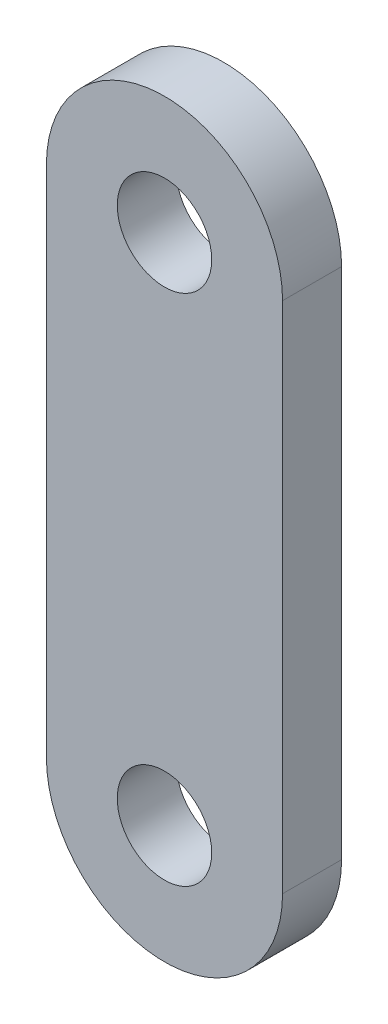
ISO-10303-21;
HEADER;
FILE_DESCRIPTION(('STEP AP214'),'2;1');
FILE_NAME('part.step','',(''),(''),'','','');
FILE_SCHEMA(('AUTOMOTIVE_DESIGN { 1 0 10303 214 1 1 1 1 }'));
ENDSEC;
DATA;
#1=APPLICATION_CONTEXT('core data for automotive mechanical design processes');
#2=APPLICATION_PROTOCOL_DEFINITION('international standard','automotive_design',2000,#1);
#3=PRODUCT_CONTEXT('',#1,'mechanical');
#4=PRODUCT('Part','Part','',(#3));
#5=PRODUCT_RELATED_PRODUCT_CATEGORY('part','',(#4));
#6=PRODUCT_DEFINITION_FORMATION('','',#4);
#7=PRODUCT_DEFINITION_CONTEXT('part definition',#1,'design');
#8=PRODUCT_DEFINITION('design','',#6,#7);
#9=PRODUCT_DEFINITION_SHAPE('','',#8);
#10=(LENGTH_UNIT() NAMED_UNIT(*) SI_UNIT(.MILLI.,.METRE.));
#11=(NAMED_UNIT(*) PLANE_ANGLE_UNIT() SI_UNIT($,.RADIAN.));
#12=(NAMED_UNIT(*) SI_UNIT($,.STERADIAN.) SOLID_ANGLE_UNIT());
#13=UNCERTAINTY_MEASURE_WITH_UNIT(LENGTH_MEASURE(1.E-05),#10,'distance_accuracy_value','');
#14=(GEOMETRIC_REPRESENTATION_CONTEXT(3) GLOBAL_UNCERTAINTY_ASSIGNED_CONTEXT((#13)) GLOBAL_UNIT_ASSIGNED_CONTEXT((#10,
#11,#12)) REPRESENTATION_CONTEXT('',''));
#15=CARTESIAN_POINT('',(0.,0.,0.));
#16=DIRECTION('',(0.,0.,1.));
#17=DIRECTION('',(1.,0.,0.));
#18=AXIS2_PLACEMENT_3D('',#15,#16,#17);
#19=CARTESIAN_POINT('',(0.,0.,5.));
#20=DIRECTION('',(0.,0.,1.));
#21=DIRECTION('',(1.,0.,0.));
#22=AXIS2_PLACEMENT_3D('',#19,#20,#21);
#23=PLANE('',#22);
#24=CARTESIAN_POINT('',(0.,43.5,5.));
#25=DIRECTION('',(0.,0.,1.));
#26=DIRECTION('',(1.,0.,0.));
#27=AXIS2_PLACEMENT_3D('',#24,#25,#26);
#28=CIRCLE('',#27,4.);
#29=CARTESIAN_POINT('',(4.,43.5,5.));
#30=VERTEX_POINT('',#29);
#31=EDGE_CURVE('E118',#30,#30,#28,.T.);
#32=ORIENTED_EDGE('',*,*,#31,.F.);
#33=EDGE_LOOP('',(#32));
#34=FACE_BOUND('',#33,.T.);
#35=CARTESIAN_POINT('',(0.,0.,5.));
#36=DIRECTION('',(0.,0.,1.));
#37=DIRECTION('',(1.,0.,0.));
#38=AXIS2_PLACEMENT_3D('',#35,#36,#37);
#39=CIRCLE('',#38,10.);
#40=CARTESIAN_POINT('',(-10.,0.,5.));
#41=VERTEX_POINT('',#40);
#42=CARTESIAN_POINT('',(10.,0.,5.));
#43=VERTEX_POINT('',#42);
#44=EDGE_CURVE('E96',#41,#43,#39,.T.);
#45=ORIENTED_EDGE('',*,*,#44,.T.);
#46=DIRECTION('',(0.,1.,0.));
#47=VECTOR('',#46,1.);
#48=CARTESIAN_POINT('',(10.,0.,5.));
#49=LINE('',#48,#47);
#50=CARTESIAN_POINT('',(10.,43.5,5.));
#51=VERTEX_POINT('',#50);
#52=EDGE_CURVE('E91',#43,#51,#49,.T.);
#53=ORIENTED_EDGE('',*,*,#52,.T.);
#54=CARTESIAN_POINT('',(0.,43.5,5.));
#55=DIRECTION('',(0.,0.,1.));
#56=DIRECTION('',(1.,0.,0.));
#57=AXIS2_PLACEMENT_3D('',#54,#55,#56);
#58=CIRCLE('',#57,10.);
#59=CARTESIAN_POINT('',(-10.,43.5,5.));
#60=VERTEX_POINT('',#59);
#61=EDGE_CURVE('E94',#51,#60,#58,.T.);
#62=ORIENTED_EDGE('',*,*,#61,.T.);
#63=DIRECTION('',(0.,-1.,0.));
#64=VECTOR('',#63,1.);
#65=CARTESIAN_POINT('',(-10.,0.,5.));
#66=LINE('',#65,#64);
#67=EDGE_CURVE('E61',#60,#41,#66,.T.);
#68=ORIENTED_EDGE('',*,*,#67,.T.);
#69=EDGE_LOOP('',(#45,#53,#62,#68));
#70=FACE_BOUND('',#69,.T.);
#71=CARTESIAN_POINT('',(0.,0.,5.));
#72=DIRECTION('',(0.,0.,1.));
#73=DIRECTION('',(1.,0.,0.));
#74=AXIS2_PLACEMENT_3D('',#71,#72,#73);
#75=CIRCLE('',#74,4.);
#76=CARTESIAN_POINT('',(4.,0.,5.));
#77=VERTEX_POINT('',#76);
#78=EDGE_CURVE('E140',#77,#77,#75,.T.);
#79=ORIENTED_EDGE('',*,*,#78,.F.);
#80=EDGE_LOOP('',(#79));
#81=FACE_BOUND('',#80,.T.);
#82=ADVANCED_FACE('F43',(#34,#70,#81),#23,.T.);
#83=CARTESIAN_POINT('',(0.,0.,0.));
#84=DIRECTION('',(0.,0.,1.));
#85=DIRECTION('',(1.,0.,0.));
#86=AXIS2_PLACEMENT_3D('',#83,#84,#85);
#87=PLANE('',#86);
#88=CARTESIAN_POINT('',(0.,0.,0.));
#89=DIRECTION('',(0.,0.,1.));
#90=DIRECTION('',(1.,0.,0.));
#91=AXIS2_PLACEMENT_3D('',#88,#89,#90);
#92=CIRCLE('',#91,10.);
#93=CARTESIAN_POINT('',(-10.,0.,0.));
#94=VERTEX_POINT('',#93);
#95=CARTESIAN_POINT('',(10.,0.,0.));
#96=VERTEX_POINT('',#95);
#97=EDGE_CURVE('E114',#94,#96,#92,.T.);
#98=ORIENTED_EDGE('',*,*,#97,.F.);
#99=DIRECTION('',(0.,-1.,0.));
#100=VECTOR('',#99,1.);
#101=CARTESIAN_POINT('',(-10.,0.,0.));
#102=LINE('',#101,#100);
#103=CARTESIAN_POINT('',(-10.,43.5,0.));
#104=VERTEX_POINT('',#103);
#105=EDGE_CURVE('E84',#104,#94,#102,.T.);
#106=ORIENTED_EDGE('',*,*,#105,.F.);
#107=CARTESIAN_POINT('',(0.,43.5,0.));
#108=DIRECTION('',(0.,0.,1.));
#109=DIRECTION('',(1.,0.,0.));
#110=AXIS2_PLACEMENT_3D('',#107,#108,#109);
#111=CIRCLE('',#110,10.);
#112=CARTESIAN_POINT('',(10.,43.5,0.));
#113=VERTEX_POINT('',#112);
#114=EDGE_CURVE('E78',#113,#104,#111,.T.);
#115=ORIENTED_EDGE('',*,*,#114,.F.);
#116=DIRECTION('',(0.,1.,0.));
#117=VECTOR('',#116,1.);
#118=CARTESIAN_POINT('',(10.,0.,0.));
#119=LINE('',#118,#117);
#120=EDGE_CURVE('E101',#96,#113,#119,.T.);
#121=ORIENTED_EDGE('',*,*,#120,.F.);
#122=EDGE_LOOP('',(#98,#106,#115,#121));
#123=FACE_BOUND('',#122,.T.);
#124=CARTESIAN_POINT('',(0.,43.5,0.));
#125=DIRECTION('',(0.,0.,1.));
#126=DIRECTION('',(1.,0.,0.));
#127=AXIS2_PLACEMENT_3D('',#124,#125,#126);
#128=CIRCLE('',#127,4.);
#129=CARTESIAN_POINT('',(4.,43.5,0.));
#130=VERTEX_POINT('',#129);
#131=EDGE_CURVE('E137',#130,#130,#128,.T.);
#132=ORIENTED_EDGE('',*,*,#131,.T.);
#133=EDGE_LOOP('',(#132));
#134=FACE_BOUND('',#133,.T.);
#135=CARTESIAN_POINT('',(0.,0.,0.));
#136=DIRECTION('',(0.,0.,1.));
#137=DIRECTION('',(1.,0.,0.));
#138=AXIS2_PLACEMENT_3D('',#135,#136,#137);
#139=CIRCLE('',#138,4.);
#140=CARTESIAN_POINT('',(4.,0.,0.));
#141=VERTEX_POINT('',#140);
#142=EDGE_CURVE('E144',#141,#141,#139,.T.);
#143=ORIENTED_EDGE('',*,*,#142,.T.);
#144=EDGE_LOOP('',(#143));
#145=FACE_BOUND('',#144,.T.);
#146=ADVANCED_FACE('F132',(#123,#134,#145),#87,.F.);
#147=CARTESIAN_POINT('',(0.,0.,5.));
#148=DIRECTION('',(0.,0.,-1.));
#149=DIRECTION('',(-1.,0.,0.));
#150=AXIS2_PLACEMENT_3D('',#147,#148,#149);
#151=CYLINDRICAL_SURFACE('',#150,10.);
#152=ORIENTED_EDGE('',*,*,#97,.T.);
#153=DIRECTION('',(0.,0.,-1.));
#154=VECTOR('',#153,1.);
#155=CARTESIAN_POINT('',(10.,0.,5.));
#156=LINE('',#155,#154);
#157=EDGE_CURVE('E11',#43,#96,#156,.T.);
#158=ORIENTED_EDGE('',*,*,#157,.F.);
#159=ORIENTED_EDGE('',*,*,#44,.F.);
#160=DIRECTION('',(0.,0.,-1.));
#161=VECTOR('',#160,1.);
#162=CARTESIAN_POINT('',(-10.,0.,5.));
#163=LINE('',#162,#161);
#164=EDGE_CURVE('E110',#41,#94,#163,.T.);
#165=ORIENTED_EDGE('',*,*,#164,.T.);
#166=EDGE_LOOP('',(#152,#158,#159,#165));
#167=FACE_BOUND('',#166,.T.);
#168=ADVANCED_FACE('F45',(#167),#151,.T.);
#169=CARTESIAN_POINT('',(10.,0.,5.));
#170=DIRECTION('',(-1.,0.,0.));
#171=DIRECTION('',(0.,0.,1.));
#172=AXIS2_PLACEMENT_3D('',#169,#170,#171);
#173=PLANE('',#172);
#174=ORIENTED_EDGE('',*,*,#120,.T.);
#175=DIRECTION('',(0.,0.,-1.));
#176=VECTOR('',#175,1.);
#177=CARTESIAN_POINT('',(10.,43.5,5.));
#178=LINE('',#177,#176);
#179=EDGE_CURVE('E53',#51,#113,#178,.T.);
#180=ORIENTED_EDGE('',*,*,#179,.F.);
#181=ORIENTED_EDGE('',*,*,#52,.F.);
#182=ORIENTED_EDGE('',*,*,#157,.T.);
#183=EDGE_LOOP('',(#174,#180,#181,#182));
#184=FACE_BOUND('',#183,.T.);
#185=ADVANCED_FACE('F100',(#184),#173,.F.);
#186=CARTESIAN_POINT('',(0.,43.5,5.));
#187=DIRECTION('',(0.,0.,-1.));
#188=DIRECTION('',(-1.,0.,0.));
#189=AXIS2_PLACEMENT_3D('',#186,#187,#188);
#190=CYLINDRICAL_SURFACE('',#189,10.);
#191=ORIENTED_EDGE('',*,*,#114,.T.);
#192=DIRECTION('',(0.,0.,-1.));
#193=VECTOR('',#192,1.);
#194=CARTESIAN_POINT('',(-10.,43.5,5.));
#195=LINE('',#194,#193);
#196=EDGE_CURVE('E103',#60,#104,#195,.T.);
#197=ORIENTED_EDGE('',*,*,#196,.F.);
#198=ORIENTED_EDGE('',*,*,#61,.F.);
#199=ORIENTED_EDGE('',*,*,#179,.T.);
#200=EDGE_LOOP('',(#191,#197,#198,#199));
#201=FACE_BOUND('',#200,.T.);
#202=ADVANCED_FACE('F104',(#201),#190,.T.);
#203=CARTESIAN_POINT('',(-10.,0.,5.));
#204=DIRECTION('',(1.,0.,0.));
#205=DIRECTION('',(0.,0.,-1.));
#206=AXIS2_PLACEMENT_3D('',#203,#204,#205);
#207=PLANE('',#206);
#208=ORIENTED_EDGE('',*,*,#105,.T.);
#209=ORIENTED_EDGE('',*,*,#164,.F.);
#210=ORIENTED_EDGE('',*,*,#67,.F.);
#211=ORIENTED_EDGE('',*,*,#196,.T.);
#212=EDGE_LOOP('',(#208,#209,#210,#211));
#213=FACE_BOUND('',#212,.T.);
#214=ADVANCED_FACE('F129',(#213),#207,.F.);
#215=CARTESIAN_POINT('',(0.,43.5,5.));
#216=DIRECTION('',(0.,0.,-1.));
#217=DIRECTION('',(-1.,0.,0.));
#218=AXIS2_PLACEMENT_3D('',#215,#216,#217);
#219=CYLINDRICAL_SURFACE('',#218,4.);
#220=ORIENTED_EDGE('',*,*,#31,.T.);
#221=EDGE_LOOP('',(#220));
#222=FACE_BOUND('',#221,.T.);
#223=ORIENTED_EDGE('',*,*,#131,.F.);
#224=EDGE_LOOP('',(#223));
#225=FACE_BOUND('',#224,.T.);
#226=ADVANCED_FACE('F160',(#222,#225),#219,.F.);
#227=CARTESIAN_POINT('',(0.,0.,5.));
#228=DIRECTION('',(0.,0.,-1.));
#229=DIRECTION('',(-1.,0.,0.));
#230=AXIS2_PLACEMENT_3D('',#227,#228,#229);
#231=CYLINDRICAL_SURFACE('',#230,4.);
#232=ORIENTED_EDGE('',*,*,#78,.T.);
#233=EDGE_LOOP('',(#232));
#234=FACE_BOUND('',#233,.T.);
#235=ORIENTED_EDGE('',*,*,#142,.F.);
#236=EDGE_LOOP('',(#235));
#237=FACE_BOUND('',#236,.T.);
#238=ADVANCED_FACE('F150',(#234,#237),#231,.F.);
#239=CLOSED_SHELL('',(#82,#146,#168,#185,#202,#214,#226,#238));
#240=MANIFOLD_SOLID_BREP('B2',#239);
#241=ADVANCED_BREP_SHAPE_REPRESENTATION('',(#18,#240),#14);
#242=SHAPE_DEFINITION_REPRESENTATION(#9,#241);
ENDSEC;
END-ISO-10303-21;
